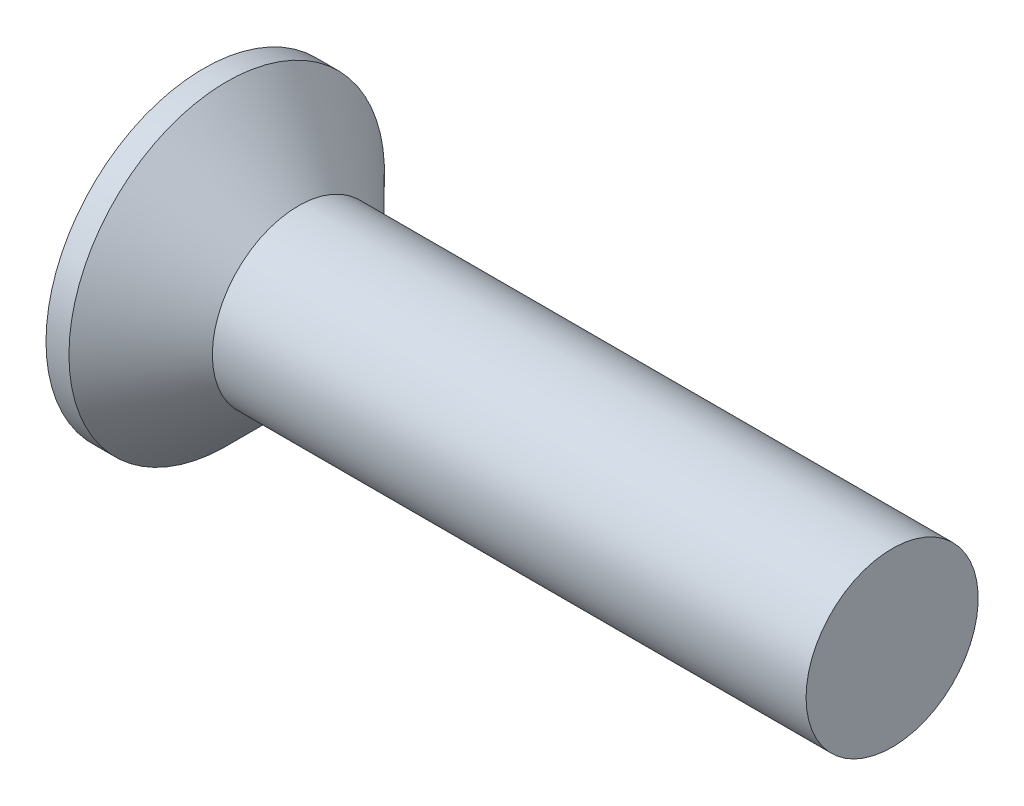
ISO-10303-21;
HEADER;
FILE_DESCRIPTION(('STEP AP214'),'2;1');
FILE_NAME('part.step','',(''),(''),'','','');
FILE_SCHEMA(('AUTOMOTIVE_DESIGN { 1 0 10303 214 1 1 1 1 }'));
ENDSEC;
DATA;
#1=APPLICATION_CONTEXT('core data for automotive mechanical design processes');
#2=APPLICATION_PROTOCOL_DEFINITION('international standard','automotive_design',2000,#1);
#3=PRODUCT_CONTEXT('',#1,'mechanical');
#4=PRODUCT('Part','Part','',(#3));
#5=PRODUCT_RELATED_PRODUCT_CATEGORY('part','',(#4));
#6=PRODUCT_DEFINITION_FORMATION('','',#4);
#7=PRODUCT_DEFINITION_CONTEXT('part definition',#1,'design');
#8=PRODUCT_DEFINITION('design','',#6,#7);
#9=PRODUCT_DEFINITION_SHAPE('','',#8);
#10=(LENGTH_UNIT() NAMED_UNIT(*) SI_UNIT(.MILLI.,.METRE.));
#11=(NAMED_UNIT(*) PLANE_ANGLE_UNIT() SI_UNIT($,.RADIAN.));
#12=(NAMED_UNIT(*) SI_UNIT($,.STERADIAN.) SOLID_ANGLE_UNIT());
#13=UNCERTAINTY_MEASURE_WITH_UNIT(LENGTH_MEASURE(1.E-05),#10,'distance_accuracy_value','');
#14=(GEOMETRIC_REPRESENTATION_CONTEXT(3) GLOBAL_UNCERTAINTY_ASSIGNED_CONTEXT((#13)) GLOBAL_UNIT_ASSIGNED_CONTEXT((#10,
#11,#12)) REPRESENTATION_CONTEXT('',''));
#15=CARTESIAN_POINT('',(0.,0.,0.));
#16=DIRECTION('',(0.,0.,1.));
#17=DIRECTION('',(1.,0.,0.));
#18=AXIS2_PLACEMENT_3D('',#15,#16,#17);
#19=CARTESIAN_POINT('',(0.,2.75,0.));
#20=DIRECTION('',(1.,0.,0.));
#21=DIRECTION('',(0.,0.,-1.));
#22=AXIS2_PLACEMENT_3D('',#19,#20,#21);
#23=PLANE('',#22);
#24=CARTESIAN_POINT('',(0.,0.,0.));
#25=DIRECTION('',(-1.,0.,0.));
#26=DIRECTION('',(0.,0.,1.));
#27=AXIS2_PLACEMENT_3D('',#24,#25,#26);
#28=CIRCLE('',#27,2.75);
#29=CARTESIAN_POINT('',(0.,0.,2.75));
#30=VERTEX_POINT('',#29);
#31=EDGE_CURVE('E45',#30,#30,#28,.T.);
#32=ORIENTED_EDGE('',*,*,#31,.T.);
#33=EDGE_LOOP('',(#32));
#34=FACE_BOUND('',#33,.T.);
#35=ADVANCED_FACE('F31',(#34),#23,.F.);
#36=CARTESIAN_POINT('',(12.,0.,0.));
#37=DIRECTION('',(-1.,0.,0.));
#38=DIRECTION('',(0.,0.,1.));
#39=AXIS2_PLACEMENT_3D('',#36,#37,#38);
#40=PLANE('',#39);
#41=CARTESIAN_POINT('',(12.,0.,0.));
#42=DIRECTION('',(-1.,0.,0.));
#43=DIRECTION('',(0.,0.,1.));
#44=AXIS2_PLACEMENT_3D('',#41,#42,#43);
#45=CIRCLE('',#44,1.5);
#46=CARTESIAN_POINT('',(12.,0.,1.5));
#47=VERTEX_POINT('',#46);
#48=EDGE_CURVE('E10',#47,#47,#45,.T.);
#49=ORIENTED_EDGE('',*,*,#48,.F.);
#50=EDGE_LOOP('',(#49));
#51=FACE_BOUND('',#50,.T.);
#52=ADVANCED_FACE('F65',(#51),#40,.F.);
#53=CARTESIAN_POINT('',(0.,0.,0.));
#54=DIRECTION('',(-1.,0.,0.));
#55=DIRECTION('',(0.,0.,1.));
#56=AXIS2_PLACEMENT_3D('',#53,#54,#55);
#57=CYLINDRICAL_SURFACE('',#56,1.5);
#58=CARTESIAN_POINT('',(1.65,0.,0.));
#59=DIRECTION('',(-1.,0.,0.));
#60=DIRECTION('',(0.,0.,1.));
#61=AXIS2_PLACEMENT_3D('',#58,#59,#60);
#62=CIRCLE('',#61,1.5);
#63=CARTESIAN_POINT('',(1.65,0.,1.5));
#64=VERTEX_POINT('',#63);
#65=EDGE_CURVE('E37',#64,#64,#62,.T.);
#66=ORIENTED_EDGE('',*,*,#65,.F.);
#67=EDGE_LOOP('',(#66));
#68=FACE_BOUND('',#67,.T.);
#69=ORIENTED_EDGE('',*,*,#48,.T.);
#70=EDGE_LOOP('',(#69));
#71=FACE_BOUND('',#70,.T.);
#72=ADVANCED_FACE('F60',(#68,#71),#57,.T.);
#73=CARTESIAN_POINT('',(1.65,0.,0.));
#74=DIRECTION('',(-1.,0.,0.));
#75=DIRECTION('',(0.,0.,1.));
#76=AXIS2_PLACEMENT_3D('',#73,#74,#75);
#77=CONICAL_SURFACE('',#76,1.5,0.78539816339745);
#78=CARTESIAN_POINT('',(0.400000000000003,0.,0.));
#79=DIRECTION('',(-1.,0.,0.));
#80=DIRECTION('',(0.,0.,1.));
#81=AXIS2_PLACEMENT_3D('',#78,#79,#80);
#82=CIRCLE('',#81,2.75);
#83=CARTESIAN_POINT('',(0.400000000000003,0.,2.75));
#84=VERTEX_POINT('',#83);
#85=EDGE_CURVE('E41',#84,#84,#82,.T.);
#86=ORIENTED_EDGE('',*,*,#85,.F.);
#87=EDGE_LOOP('',(#86));
#88=FACE_BOUND('',#87,.T.);
#89=ORIENTED_EDGE('',*,*,#65,.T.);
#90=EDGE_LOOP('',(#89));
#91=FACE_BOUND('',#90,.T.);
#92=ADVANCED_FACE('F55',(#88,#91),#77,.T.);
#93=CARTESIAN_POINT('',(0.,0.,0.));
#94=DIRECTION('',(-1.,0.,0.));
#95=DIRECTION('',(0.,0.,1.));
#96=AXIS2_PLACEMENT_3D('',#93,#94,#95);
#97=CYLINDRICAL_SURFACE('',#96,2.75);
#98=ORIENTED_EDGE('',*,*,#31,.F.);
#99=EDGE_LOOP('',(#98));
#100=FACE_BOUND('',#99,.T.);
#101=ORIENTED_EDGE('',*,*,#85,.T.);
#102=EDGE_LOOP('',(#101));
#103=FACE_BOUND('',#102,.T.);
#104=ADVANCED_FACE('F52',(#100,#103),#97,.T.);
#105=CLOSED_SHELL('',(#35,#52,#72,#92,#104));
#106=MANIFOLD_SOLID_BREP('B2',#105);
#107=ADVANCED_BREP_SHAPE_REPRESENTATION('',(#18,#106),#14);
#108=SHAPE_DEFINITION_REPRESENTATION(#9,#107);
ENDSEC;
END-ISO-10303-21;
